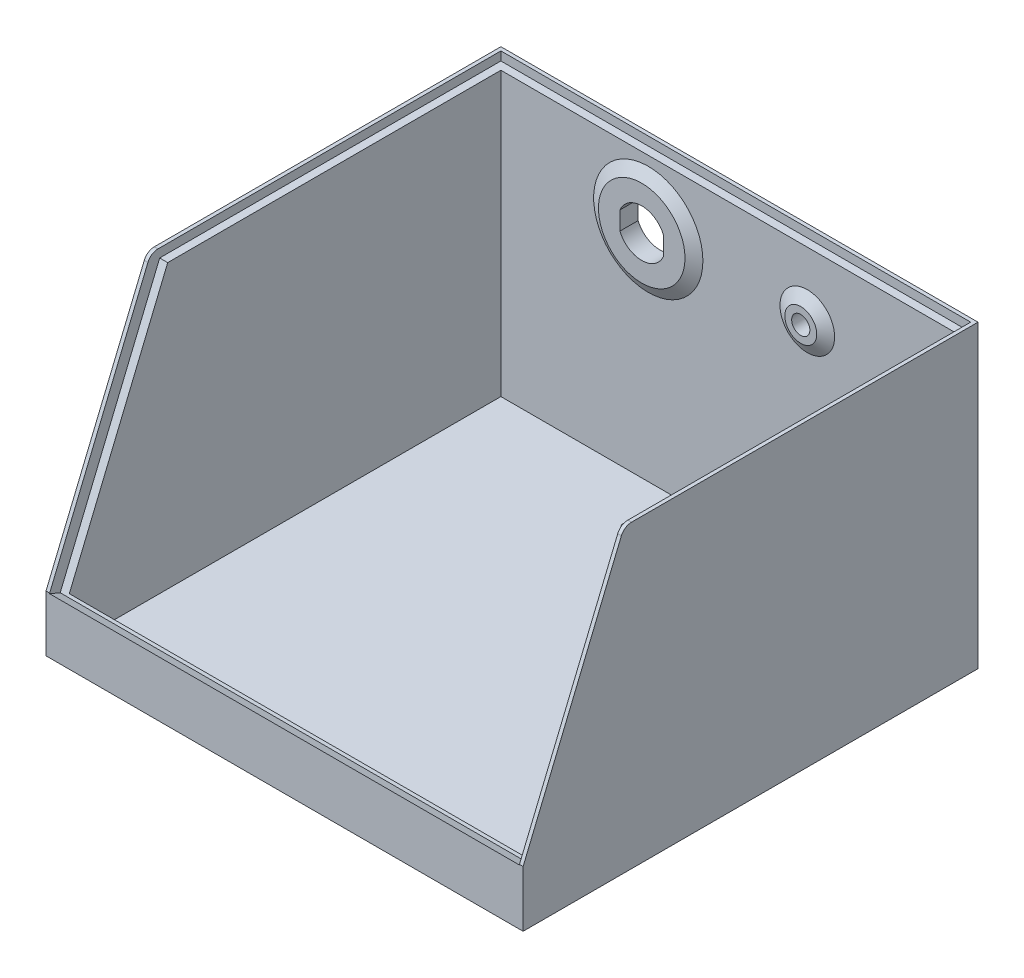
ISO-10303-21;
HEADER;
FILE_DESCRIPTION(('STEP AP214'),'2;1');
FILE_NAME('part.step','',(''),(''),'','','');
FILE_SCHEMA(('AUTOMOTIVE_DESIGN { 1 0 10303 214 1 1 1 1 }'));
ENDSEC;
DATA;
#1=APPLICATION_CONTEXT('core data for automotive mechanical design processes');
#2=APPLICATION_PROTOCOL_DEFINITION('international standard','automotive_design',2000,#1);
#3=PRODUCT_CONTEXT('',#1,'mechanical');
#4=PRODUCT('Part','Part','',(#3));
#5=PRODUCT_RELATED_PRODUCT_CATEGORY('part','',(#4));
#6=PRODUCT_DEFINITION_FORMATION('','',#4);
#7=PRODUCT_DEFINITION_CONTEXT('part definition',#1,'design');
#8=PRODUCT_DEFINITION('design','',#6,#7);
#9=PRODUCT_DEFINITION_SHAPE('','',#8);
#10=(LENGTH_UNIT() NAMED_UNIT(*) SI_UNIT(.MILLI.,.METRE.));
#11=(NAMED_UNIT(*) PLANE_ANGLE_UNIT() SI_UNIT($,.RADIAN.));
#12=(NAMED_UNIT(*) SI_UNIT($,.STERADIAN.) SOLID_ANGLE_UNIT());
#13=UNCERTAINTY_MEASURE_WITH_UNIT(LENGTH_MEASURE(1.E-05),#10,'distance_accuracy_value','');
#14=(GEOMETRIC_REPRESENTATION_CONTEXT(3) GLOBAL_UNCERTAINTY_ASSIGNED_CONTEXT((#13)) GLOBAL_UNIT_ASSIGNED_CONTEXT((#10,
#11,#12)) REPRESENTATION_CONTEXT('',''));
#15=CARTESIAN_POINT('',(0.,0.,0.));
#16=DIRECTION('',(0.,0.,1.));
#17=DIRECTION('',(1.,0.,0.));
#18=AXIS2_PLACEMENT_3D('',#15,#16,#17);
#19=CARTESIAN_POINT('',(0.,80.,-1.41509433962266));
#20=DIRECTION('',(0.,0.,-1.));
#21=DIRECTION('',(-1.,0.,0.));
#22=AXIS2_PLACEMENT_3D('',#19,#20,#21);
#23=PLANE('',#22);
#24=DIRECTION('',(0.,-1.,0.));
#25=VECTOR('',#24,1.);
#26=CARTESIAN_POINT('',(0.,80.,-1.41509433962266));
#27=LINE('',#26,#25);
#28=CARTESIAN_POINT('',(0.,12.3822143173166,-1.41509433962266));
#29=VERTEX_POINT('',#28);
#30=CARTESIAN_POINT('',(0.,0.,-1.41509433962266));
#31=VERTEX_POINT('',#30);
#32=EDGE_CURVE('E319',#29,#31,#27,.T.);
#33=ORIENTED_EDGE('',*,*,#32,.F.);
#34=DIRECTION('',(1.,0.,0.));
#35=VECTOR('',#34,1.);
#36=CARTESIAN_POINT('',(0.,12.3822143173166,-1.41509433962266));
#37=LINE('',#36,#35);
#38=CARTESIAN_POINT('',(124.6,12.3822143173166,-1.41509433962266));
#39=VERTEX_POINT('',#38);
#40=EDGE_CURVE('E286',#29,#39,#37,.T.);
#41=ORIENTED_EDGE('',*,*,#40,.T.);
#42=DIRECTION('',(0.,-1.,0.));
#43=VECTOR('',#42,1.);
#44=CARTESIAN_POINT('',(124.6,80.,-1.41509433962266));
#45=LINE('',#44,#43);
#46=CARTESIAN_POINT('',(124.6,0.,-1.41509433962266));
#47=VERTEX_POINT('',#46);
#48=EDGE_CURVE('E317',#39,#47,#45,.T.);
#49=ORIENTED_EDGE('',*,*,#48,.T.);
#50=DIRECTION('',(1.,0.,0.));
#51=VECTOR('',#50,1.);
#52=CARTESIAN_POINT('',(0.,0.,-1.41509433962266));
#53=LINE('',#52,#51);
#54=EDGE_CURVE('E304',#31,#47,#53,.T.);
#55=ORIENTED_EDGE('',*,*,#54,.F.);
#56=EDGE_LOOP('',(#33,#41,#49,#55));
#57=FACE_BOUND('',#56,.T.);
#58=ADVANCED_FACE('F39',(#57),#23,.T.);
#59=CARTESIAN_POINT('',(-3.20000000000001,13.0187338929315,1.78490566037734));
#60=DIRECTION('',(0.,-0.382683432365084,-0.923879532511289));
#61=DIRECTION('',(0.,0.923879532511289,-0.382683432365084));
#62=AXIS2_PLACEMENT_3D('',#59,#60,#61);
#63=PLANE('',#62);
#64=DIRECTION('',(0.,-0.923879532511289,0.382683432365084));
#65=VECTOR('',#64,1.);
#66=CARTESIAN_POINT('',(-2.20000000000001,80.,-25.9596431860913));
#67=LINE('',#66,#65);
#68=CARTESIAN_POINT('',(-2.20000000000001,78.1480502970952,-25.1925405023153));
#69=VERTEX_POINT('',#68);
#70=CARTESIAN_POINT('',(-2.2,13.0187338929315,1.78490566037735));
#71=VERTEX_POINT('',#70);
#72=EDGE_CURVE('E263',#69,#71,#67,.T.);
#73=ORIENTED_EDGE('',*,*,#72,.F.);
#74=DIRECTION('',(1.,0.,0.));
#75=VECTOR('',#74,1.);
#76=CARTESIAN_POINT('',(-3.20000000000001,78.1480502970953,-25.1925405023153));
#77=LINE('',#76,#75);
#78=CARTESIAN_POINT('',(-3.20000000000001,78.1480502970953,-25.1925405023153));
#79=VERTEX_POINT('',#78);
#80=EDGE_CURVE('E373',#69,#79,#77,.F.);
#81=ORIENTED_EDGE('',*,*,#80,.T.);
#82=DIRECTION('',(0.,0.923879532511289,-0.382683432365084));
#83=VECTOR('',#82,1.);
#84=CARTESIAN_POINT('',(-3.20000000000001,13.0187338929315,1.78490566037734));
#85=LINE('',#84,#83);
#86=CARTESIAN_POINT('',(-3.20000000000001,13.0187338929315,1.78490566037734));
#87=VERTEX_POINT('',#86);
#88=EDGE_CURVE('E292',#87,#79,#85,.T.);
#89=ORIENTED_EDGE('',*,*,#88,.F.);
#90=DIRECTION('',(1.,0.,0.));
#91=VECTOR('',#90,1.);
#92=CARTESIAN_POINT('',(-3.20000000000001,13.0187338929315,1.78490566037734));
#93=LINE('',#92,#91);
#94=EDGE_CURVE('E298',#87,#71,#93,.T.);
#95=ORIENTED_EDGE('',*,*,#94,.T.);
#96=EDGE_LOOP('',(#73,#81,#89,#95));
#97=FACE_BOUND('',#96,.T.);
#98=ADVANCED_FACE('F403',(#97),#63,.F.);
#99=CARTESIAN_POINT('',(-3.2,-2.4,0.));
#100=DIRECTION('',(1.,0.,0.));
#101=DIRECTION('',(0.,0.,-1.));
#102=AXIS2_PLACEMENT_3D('',#99,#100,#101);
#103=PLANE('',#102);
#104=ORIENTED_EDGE('',*,*,#88,.T.);
#105=CARTESIAN_POINT('',(-3.2,77.,-27.9641790998492));
#106=DIRECTION('',(1.,0.,0.));
#107=DIRECTION('',(0.,0.,-1.));
#108=AXIS2_PLACEMENT_3D('',#105,#106,#107);
#109=CIRCLE('',#108,3.);
#110=CARTESIAN_POINT('',(-3.2,80.,-27.9641790998492));
#111=VERTEX_POINT('',#110);
#112=EDGE_CURVE('E375',#79,#111,#109,.F.);
#113=ORIENTED_EDGE('',*,*,#112,.T.);
#114=DIRECTION('',(0.,0.,1.));
#115=VECTOR('',#114,1.);
#116=CARTESIAN_POINT('',(-3.2,80.,1.78490566037734));
#117=LINE('',#116,#115);
#118=CARTESIAN_POINT('',(-3.2,80.,-123.115094339623));
#119=VERTEX_POINT('',#118);
#120=EDGE_CURVE('E321',#119,#111,#117,.T.);
#121=ORIENTED_EDGE('',*,*,#120,.F.);
#122=DIRECTION('',(0.,1.,0.));
#123=VECTOR('',#122,1.);
#124=CARTESIAN_POINT('',(-3.2,-2.4,-123.115094339623));
#125=LINE('',#124,#123);
#126=CARTESIAN_POINT('',(-3.2,-2.4,-123.115094339623));
#127=VERTEX_POINT('',#126);
#128=EDGE_CURVE('E341',#127,#119,#125,.T.);
#129=ORIENTED_EDGE('',*,*,#128,.F.);
#130=DIRECTION('',(0.,0.,-1.));
#131=VECTOR('',#130,1.);
#132=CARTESIAN_POINT('',(-3.2,-2.4,0.));
#133=LINE('',#132,#131);
#134=CARTESIAN_POINT('',(-3.2,-2.4,1.78490566037734));
#135=VERTEX_POINT('',#134);
#136=EDGE_CURVE('E329',#135,#127,#133,.T.);
#137=ORIENTED_EDGE('',*,*,#136,.F.);
#138=DIRECTION('',(0.,1.,0.));
#139=VECTOR('',#138,1.);
#140=CARTESIAN_POINT('',(-3.2,-2.4,1.78490566037734));
#141=LINE('',#140,#139);
#142=EDGE_CURVE('E340',#135,#87,#141,.T.);
#143=ORIENTED_EDGE('',*,*,#142,.T.);
#144=EDGE_LOOP('',(#104,#113,#121,#129,#137,#143));
#145=FACE_BOUND('',#144,.T.);
#146=ADVANCED_FACE('F409',(#145),#103,.F.);
#147=CARTESIAN_POINT('',(0.,-2.4,-123.115094339623));
#148=DIRECTION('',(0.,0.,1.));
#149=DIRECTION('',(1.,0.,0.));
#150=AXIS2_PLACEMENT_3D('',#147,#148,#149);
#151=PLANE('',#150);
#152=DIRECTION('',(0.,-1.,0.));
#153=VECTOR('',#152,1.);
#154=CARTESIAN_POINT('',(34.4722666666666,0.,-123.115094339623));
#155=LINE('',#154,#153);
#156=CARTESIAN_POINT('',(34.4722666666667,62.5195980631839,-123.115094339623));
#157=VERTEX_POINT('',#156);
#158=CARTESIAN_POINT('',(34.4722666666667,57.4804019368161,-123.115094339623));
#159=VERTEX_POINT('',#158);
#160=EDGE_CURVE('E205',#157,#159,#155,.T.);
#161=ORIENTED_EDGE('',*,*,#160,.T.);
#162=CARTESIAN_POINT('',(40.4666666666667,60.,-123.115094339623));
#163=DIRECTION('',(0.,0.,-1.));
#164=DIRECTION('',(-1.,0.,0.));
#165=AXIS2_PLACEMENT_3D('',#162,#163,#164);
#166=CIRCLE('',#165,6.5024);
#167=CARTESIAN_POINT('',(46.4610666666667,57.4804019368161,-123.115094339623));
#168=VERTEX_POINT('',#167);
#169=EDGE_CURVE('E54',#168,#159,#166,.T.);
#170=ORIENTED_EDGE('',*,*,#169,.F.);
#171=DIRECTION('',(0.,-1.,0.));
#172=VECTOR('',#171,1.);
#173=CARTESIAN_POINT('',(46.4610666666667,0.,-123.115094339623));
#174=LINE('',#173,#172);
#175=CARTESIAN_POINT('',(46.4610666666667,62.5195980631839,-123.115094339623));
#176=VERTEX_POINT('',#175);
#177=EDGE_CURVE('E212',#176,#168,#174,.T.);
#178=ORIENTED_EDGE('',*,*,#177,.F.);
#179=CARTESIAN_POINT('',(40.4666666666667,60.,-123.115094339623));
#180=DIRECTION('',(0.,0.,-1.));
#181=DIRECTION('',(-1.,0.,0.));
#182=AXIS2_PLACEMENT_3D('',#179,#180,#181);
#183=CIRCLE('',#182,6.5024);
#184=EDGE_CURVE('E196',#157,#176,#183,.T.);
#185=ORIENTED_EDGE('',*,*,#184,.F.);
#186=EDGE_LOOP('',(#161,#170,#178,#185));
#187=FACE_BOUND('',#186,.T.);
#188=CARTESIAN_POINT('',(84.1333333333333,60.,-123.115094339623));
#189=DIRECTION('',(0.,0.,-1.));
#190=DIRECTION('',(-1.,0.,0.));
#191=AXIS2_PLACEMENT_3D('',#188,#189,#190);
#192=CIRCLE('',#191,2.5);
#193=CARTESIAN_POINT('',(81.6333333333333,60.,-123.115094339623));
#194=VERTEX_POINT('',#193);
#195=EDGE_CURVE('E222',#194,#194,#192,.T.);
#196=ORIENTED_EDGE('',*,*,#195,.F.);
#197=EDGE_LOOP('',(#196));
#198=FACE_BOUND('',#197,.T.);
#199=ORIENTED_EDGE('',*,*,#128,.T.);
#200=DIRECTION('',(-1.,0.,0.));
#201=VECTOR('',#200,1.);
#202=CARTESIAN_POINT('',(-3.2,80.,-123.115094339623));
#203=LINE('',#202,#201);
#204=CARTESIAN_POINT('',(127.8,80.,-123.115094339623));
#205=VERTEX_POINT('',#204);
#206=EDGE_CURVE('E326',#205,#119,#203,.T.);
#207=ORIENTED_EDGE('',*,*,#206,.F.);
#208=DIRECTION('',(0.,1.,0.));
#209=VECTOR('',#208,1.);
#210=CARTESIAN_POINT('',(127.8,-2.4,-123.115094339623));
#211=LINE('',#210,#209);
#212=CARTESIAN_POINT('',(127.8,-2.4,-123.115094339623));
#213=VERTEX_POINT('',#212);
#214=EDGE_CURVE('E344',#213,#205,#211,.T.);
#215=ORIENTED_EDGE('',*,*,#214,.F.);
#216=DIRECTION('',(1.,0.,0.));
#217=VECTOR('',#216,1.);
#218=CARTESIAN_POINT('',(0.,-2.4,-123.115094339623));
#219=LINE('',#218,#217);
#220=EDGE_CURVE('E338',#127,#213,#219,.T.);
#221=ORIENTED_EDGE('',*,*,#220,.F.);
#222=EDGE_LOOP('',(#199,#207,#215,#221));
#223=FACE_BOUND('',#222,.T.);
#224=ADVANCED_FACE('F209',(#187,#198,#223),#151,.F.);
#225=CARTESIAN_POINT('',(127.8,-2.4,0.));
#226=DIRECTION('',(1.,0.,0.));
#227=DIRECTION('',(0.,0.,-1.));
#228=AXIS2_PLACEMENT_3D('',#225,#226,#227);
#229=PLANE('',#228);
#230=DIRECTION('',(0.,0.,-1.));
#231=VECTOR('',#230,1.);
#232=CARTESIAN_POINT('',(127.8,80.,1.78490566037734));
#233=LINE('',#232,#231);
#234=CARTESIAN_POINT('',(127.8,80.,-27.9641790998492));
#235=VERTEX_POINT('',#234);
#236=EDGE_CURVE('E324',#235,#205,#233,.T.);
#237=ORIENTED_EDGE('',*,*,#236,.F.);
#238=CARTESIAN_POINT('',(127.8,77.,-27.9641790998492));
#239=DIRECTION('',(1.,0.,0.));
#240=DIRECTION('',(0.,0.,-1.));
#241=AXIS2_PLACEMENT_3D('',#238,#239,#240);
#242=CIRCLE('',#241,3.);
#243=CARTESIAN_POINT('',(127.8,78.1480502970953,-25.1925405023153));
#244=VERTEX_POINT('',#243);
#245=EDGE_CURVE('E365',#235,#244,#242,.T.);
#246=ORIENTED_EDGE('',*,*,#245,.T.);
#247=DIRECTION('',(0.,0.923879532511289,-0.382683432365084));
#248=VECTOR('',#247,1.);
#249=CARTESIAN_POINT('',(127.8,13.0187338929315,1.78490566037734));
#250=LINE('',#249,#248);
#251=CARTESIAN_POINT('',(127.8,13.0187338929315,1.78490566037734));
#252=VERTEX_POINT('',#251);
#253=EDGE_CURVE('E291',#252,#244,#250,.T.);
#254=ORIENTED_EDGE('',*,*,#253,.F.);
#255=DIRECTION('',(0.,1.,0.));
#256=VECTOR('',#255,1.);
#257=CARTESIAN_POINT('',(127.8,-2.4,1.78490566037734));
#258=LINE('',#257,#256);
#259=CARTESIAN_POINT('',(127.8,-2.4,1.78490566037734));
#260=VERTEX_POINT('',#259);
#261=EDGE_CURVE('E347',#260,#252,#258,.T.);
#262=ORIENTED_EDGE('',*,*,#261,.F.);
#263=DIRECTION('',(0.,0.,-1.));
#264=VECTOR('',#263,1.);
#265=CARTESIAN_POINT('',(127.8,-2.4,0.));
#266=LINE('',#265,#264);
#267=EDGE_CURVE('E335',#260,#213,#266,.T.);
#268=ORIENTED_EDGE('',*,*,#267,.T.);
#269=ORIENTED_EDGE('',*,*,#214,.T.);
#270=EDGE_LOOP('',(#237,#246,#254,#262,#268,#269));
#271=FACE_BOUND('',#270,.T.);
#272=ADVANCED_FACE('F438',(#271),#229,.T.);
#273=CARTESIAN_POINT('',(0.,-2.4,1.78490566037734));
#274=DIRECTION('',(0.,0.,1.));
#275=DIRECTION('',(1.,0.,0.));
#276=AXIS2_PLACEMENT_3D('',#273,#274,#275);
#277=PLANE('',#276);
#278=DIRECTION('',(0.,-1.,0.));
#279=VECTOR('',#278,1.);
#280=CARTESIAN_POINT('',(-2.2,-2.4,1.78490566037734));
#281=LINE('',#280,#279);
#282=CARTESIAN_POINT('',(-2.2,12.8563750628877,1.78490566037734));
#283=VERTEX_POINT('',#282);
#284=EDGE_CURVE('E284',#71,#283,#281,.T.);
#285=ORIENTED_EDGE('',*,*,#284,.F.);
#286=ORIENTED_EDGE('',*,*,#94,.F.);
#287=ORIENTED_EDGE('',*,*,#142,.F.);
#288=DIRECTION('',(1.,0.,0.));
#289=VECTOR('',#288,1.);
#290=CARTESIAN_POINT('',(0.,-2.4,1.78490566037734));
#291=LINE('',#290,#289);
#292=EDGE_CURVE('E332',#135,#260,#291,.T.);
#293=ORIENTED_EDGE('',*,*,#292,.T.);
#294=ORIENTED_EDGE('',*,*,#261,.T.);
#295=CARTESIAN_POINT('',(126.8,13.0187338929315,1.78490566037734));
#296=VERTEX_POINT('',#295);
#297=EDGE_CURVE('E295',#296,#252,#93,.T.);
#298=ORIENTED_EDGE('',*,*,#297,.F.);
#299=DIRECTION('',(0.,1.,0.));
#300=VECTOR('',#299,1.);
#301=CARTESIAN_POINT('',(126.8,-2.4,1.78490566037734));
#302=LINE('',#301,#300);
#303=CARTESIAN_POINT('',(126.8,12.8563750628877,1.78490566037734));
#304=VERTEX_POINT('',#303);
#305=EDGE_CURVE('E280',#304,#296,#302,.T.);
#306=ORIENTED_EDGE('',*,*,#305,.F.);
#307=DIRECTION('',(1.,0.,0.));
#308=VECTOR('',#307,1.);
#309=CARTESIAN_POINT('',(0.,12.8563750628877,1.78490566037734));
#310=LINE('',#309,#308);
#311=EDGE_CURVE('E354',#283,#304,#310,.T.);
#312=ORIENTED_EDGE('',*,*,#311,.F.);
#313=EDGE_LOOP('',(#285,#286,#287,#293,#294,#298,#306,#312));
#314=FACE_BOUND('',#313,.T.);
#315=ADVANCED_FACE('F429',(#314),#277,.T.);
#316=CARTESIAN_POINT('',(0.,-2.4,0.));
#317=DIRECTION('',(0.,1.,0.));
#318=DIRECTION('',(0.,0.,1.));
#319=AXIS2_PLACEMENT_3D('',#316,#317,#318);
#320=PLANE('',#319);
#321=ORIENTED_EDGE('',*,*,#136,.T.);
#322=ORIENTED_EDGE('',*,*,#220,.T.);
#323=ORIENTED_EDGE('',*,*,#267,.F.);
#324=ORIENTED_EDGE('',*,*,#292,.F.);
#325=EDGE_LOOP('',(#321,#322,#323,#324));
#326=FACE_BOUND('',#325,.T.);
#327=ADVANCED_FACE('F425',(#326),#320,.F.);
#328=CARTESIAN_POINT('',(0.,80.,0.));
#329=DIRECTION('',(0.,-1.,0.));
#330=DIRECTION('',(0.,0.,-1.));
#331=AXIS2_PLACEMENT_3D('',#328,#329,#330);
#332=PLANE('',#331);
#333=DIRECTION('',(0.,0.,-1.));
#334=VECTOR('',#333,1.);
#335=CARTESIAN_POINT('',(126.8,80.,-25.9596431860913));
#336=LINE('',#335,#334);
#337=CARTESIAN_POINT('',(126.8,80.,-27.9641790998492));
#338=VERTEX_POINT('',#337);
#339=CARTESIAN_POINT('',(126.8,80.,-122.115094339623));
#340=VERTEX_POINT('',#339);
#341=EDGE_CURVE('E249',#338,#340,#336,.T.);
#342=ORIENTED_EDGE('',*,*,#341,.F.);
#343=DIRECTION('',(1.,0.,0.));
#344=VECTOR('',#343,1.);
#345=CARTESIAN_POINT('',(0.,80.,-27.9641790998492));
#346=LINE('',#345,#344);
#347=EDGE_CURVE('E362',#338,#235,#346,.T.);
#348=ORIENTED_EDGE('',*,*,#347,.T.);
#349=ORIENTED_EDGE('',*,*,#236,.T.);
#350=ORIENTED_EDGE('',*,*,#206,.T.);
#351=ORIENTED_EDGE('',*,*,#120,.T.);
#352=DIRECTION('',(1.,0.,0.));
#353=VECTOR('',#352,1.);
#354=CARTESIAN_POINT('',(0.,80.,-27.9641790998492));
#355=LINE('',#354,#353);
#356=CARTESIAN_POINT('',(-2.20000000000001,80.,-27.9641790998492));
#357=VERTEX_POINT('',#356);
#358=EDGE_CURVE('E359',#111,#357,#355,.T.);
#359=ORIENTED_EDGE('',*,*,#358,.T.);
#360=DIRECTION('',(0.,0.,1.));
#361=VECTOR('',#360,1.);
#362=CARTESIAN_POINT('',(-2.20000000000001,80.,-25.9596431860913));
#363=LINE('',#362,#361);
#364=CARTESIAN_POINT('',(-2.20000000000001,80.,-122.115094339623));
#365=VERTEX_POINT('',#364);
#366=EDGE_CURVE('E237',#365,#357,#363,.T.);
#367=ORIENTED_EDGE('',*,*,#366,.F.);
#368=DIRECTION('',(-1.,0.,0.));
#369=VECTOR('',#368,1.);
#370=CARTESIAN_POINT('',(-2.20000000000001,80.,-122.115094339623));
#371=LINE('',#370,#369);
#372=EDGE_CURVE('E241',#340,#365,#371,.T.);
#373=ORIENTED_EDGE('',*,*,#372,.F.);
#374=EDGE_LOOP('',(#342,#348,#349,#350,#351,#359,#367,#373));
#375=FACE_BOUND('',#374,.T.);
#376=ADVANCED_FACE('F421',(#375),#332,.F.);
#377=CARTESIAN_POINT('',(0.,80.,-1.41509433962266));
#378=DIRECTION('',(1.,0.,0.));
#379=DIRECTION('',(0.,0.,-1.));
#380=AXIS2_PLACEMENT_3D('',#377,#378,#379);
#381=PLANE('',#380);
#382=DIRECTION('',(0.,0.,-1.));
#383=VECTOR('',#382,1.);
#384=CARTESIAN_POINT('',(0.,77.6,-1.41509433962266));
#385=LINE('',#384,#383);
#386=CARTESIAN_POINT('',(0.,77.6,-28.4291856773315));
#387=VERTEX_POINT('',#386);
#388=CARTESIAN_POINT('',(0.,77.6,-119.915094339623));
#389=VERTEX_POINT('',#388);
#390=EDGE_CURVE('E261',#387,#389,#385,.T.);
#391=ORIENTED_EDGE('',*,*,#390,.F.);
#392=DIRECTION('',(0.,-0.923879532511289,0.382683432365084));
#393=VECTOR('',#392,1.);
#394=CARTESIAN_POINT('',(0.,70.0976045511806,-25.3215917321444));
#395=LINE('',#394,#393);
#396=EDGE_CURVE('E289',#387,#29,#395,.T.);
#397=ORIENTED_EDGE('',*,*,#396,.T.);
#398=ORIENTED_EDGE('',*,*,#32,.T.);
#399=DIRECTION('',(0.,0.,1.));
#400=VECTOR('',#399,1.);
#401=CARTESIAN_POINT('',(0.,0.,-1.41509433962266));
#402=LINE('',#401,#400);
#403=CARTESIAN_POINT('',(0.,0.,-119.915094339623));
#404=VERTEX_POINT('',#403);
#405=EDGE_CURVE('E301',#404,#31,#402,.T.);
#406=ORIENTED_EDGE('',*,*,#405,.F.);
#407=DIRECTION('',(0.,-1.,0.));
#408=VECTOR('',#407,1.);
#409=CARTESIAN_POINT('',(0.,80.,-119.915094339623));
#410=LINE('',#409,#408);
#411=EDGE_CURVE('E313',#389,#404,#410,.T.);
#412=ORIENTED_EDGE('',*,*,#411,.F.);
#413=EDGE_LOOP('',(#391,#397,#398,#406,#412));
#414=FACE_BOUND('',#413,.T.);
#415=ADVANCED_FACE('F418',(#414),#381,.T.);
#416=CARTESIAN_POINT('',(124.6,80.,-1.41509433962266));
#417=DIRECTION('',(-1.,0.,0.));
#418=DIRECTION('',(0.,0.,1.));
#419=AXIS2_PLACEMENT_3D('',#416,#417,#418);
#420=PLANE('',#419);
#421=DIRECTION('',(0.,0.,1.));
#422=VECTOR('',#421,1.);
#423=CARTESIAN_POINT('',(124.6,77.6,-1.41509433962266));
#424=LINE('',#423,#422);
#425=CARTESIAN_POINT('',(124.6,77.6,-119.915094339623));
#426=VERTEX_POINT('',#425);
#427=CARTESIAN_POINT('',(124.6,77.6,-28.4291856773315));
#428=VERTEX_POINT('',#427);
#429=EDGE_CURVE('E255',#426,#428,#424,.T.);
#430=ORIENTED_EDGE('',*,*,#429,.F.);
#431=DIRECTION('',(0.,-1.,0.));
#432=VECTOR('',#431,1.);
#433=CARTESIAN_POINT('',(124.6,80.,-119.915094339623));
#434=LINE('',#433,#432);
#435=CARTESIAN_POINT('',(124.6,0.,-119.915094339623));
#436=VERTEX_POINT('',#435);
#437=EDGE_CURVE('E315',#426,#436,#434,.T.);
#438=ORIENTED_EDGE('',*,*,#437,.T.);
#439=DIRECTION('',(0.,0.,-1.));
#440=VECTOR('',#439,1.);
#441=CARTESIAN_POINT('',(124.6,0.,-1.41509433962266));
#442=LINE('',#441,#440);
#443=EDGE_CURVE('E307',#47,#436,#442,.T.);
#444=ORIENTED_EDGE('',*,*,#443,.F.);
#445=ORIENTED_EDGE('',*,*,#48,.F.);
#446=DIRECTION('',(0.,0.923879532511289,-0.382683432365084));
#447=VECTOR('',#446,1.);
#448=CARTESIAN_POINT('',(124.6,70.0976045511806,-25.3215917321444));
#449=LINE('',#448,#447);
#450=EDGE_CURVE('E343',#39,#428,#449,.T.);
#451=ORIENTED_EDGE('',*,*,#450,.T.);
#452=EDGE_LOOP('',(#430,#438,#444,#445,#451));
#453=FACE_BOUND('',#452,.T.);
#454=ADVANCED_FACE('F416',(#453),#420,.T.);
#455=CARTESIAN_POINT('',(0.,80.,-119.915094339623));
#456=DIRECTION('',(0.,0.,1.));
#457=DIRECTION('',(1.,0.,0.));
#458=AXIS2_PLACEMENT_3D('',#455,#456,#457);
#459=PLANE('',#458);
#460=CARTESIAN_POINT('',(84.1333333333333,60.,-119.915094339623));
#461=DIRECTION('',(0.,0.,1.));
#462=DIRECTION('',(1.,0.,0.));
#463=AXIS2_PLACEMENT_3D('',#460,#461,#462);
#464=CIRCLE('',#463,7.50000000000001);
#465=CARTESIAN_POINT('',(91.6333333333333,60.,-119.915094339623));
#466=VERTEX_POINT('',#465);
#467=EDGE_CURVE('E225',#466,#466,#464,.T.);
#468=ORIENTED_EDGE('',*,*,#467,.F.);
#469=EDGE_LOOP('',(#468));
#470=FACE_BOUND('',#469,.T.);
#471=CARTESIAN_POINT('',(40.4666666666667,60.,-119.915094339623));
#472=DIRECTION('',(0.,0.,1.));
#473=DIRECTION('',(1.,0.,0.));
#474=AXIS2_PLACEMENT_3D('',#471,#472,#473);
#475=CIRCLE('',#474,15.);
#476=CARTESIAN_POINT('',(55.4666666666667,60.,-119.915094339623));
#477=VERTEX_POINT('',#476);
#478=EDGE_CURVE('E231',#477,#477,#475,.T.);
#479=ORIENTED_EDGE('',*,*,#478,.F.);
#480=EDGE_LOOP('',(#479));
#481=FACE_BOUND('',#480,.T.);
#482=DIRECTION('',(1.,0.,0.));
#483=VECTOR('',#482,1.);
#484=CARTESIAN_POINT('',(0.,77.6,-119.915094339623));
#485=LINE('',#484,#483);
#486=EDGE_CURVE('E259',#389,#426,#485,.T.);
#487=ORIENTED_EDGE('',*,*,#486,.F.);
#488=ORIENTED_EDGE('',*,*,#411,.T.);
#489=DIRECTION('',(-1.,0.,0.));
#490=VECTOR('',#489,1.);
#491=CARTESIAN_POINT('',(0.,0.,-119.915094339623));
#492=LINE('',#491,#490);
#493=EDGE_CURVE('E310',#436,#404,#492,.T.);
#494=ORIENTED_EDGE('',*,*,#493,.F.);
#495=ORIENTED_EDGE('',*,*,#437,.F.);
#496=EDGE_LOOP('',(#487,#488,#494,#495));
#497=FACE_BOUND('',#496,.T.);
#498=ADVANCED_FACE('F434',(#470,#481,#497),#459,.T.);
#499=CARTESIAN_POINT('',(0.,0.,0.));
#500=DIRECTION('',(0.,1.,0.));
#501=DIRECTION('',(0.,0.,1.));
#502=AXIS2_PLACEMENT_3D('',#499,#500,#501);
#503=PLANE('',#502);
#504=ORIENTED_EDGE('',*,*,#405,.T.);
#505=ORIENTED_EDGE('',*,*,#54,.T.);
#506=ORIENTED_EDGE('',*,*,#443,.T.);
#507=ORIENTED_EDGE('',*,*,#493,.T.);
#508=EDGE_LOOP('',(#504,#505,#506,#507));
#509=FACE_BOUND('',#508,.T.);
#510=ADVANCED_FACE('F431',(#509),#503,.T.);
#511=ORIENTED_EDGE('',*,*,#253,.T.);
#512=DIRECTION('',(1.,0.,0.));
#513=VECTOR('',#512,1.);
#514=CARTESIAN_POINT('',(-3.20000000000001,78.1480502970953,-25.1925405023153));
#515=LINE('',#514,#513);
#516=CARTESIAN_POINT('',(126.8,78.1480502970952,-25.1925405023153));
#517=VERTEX_POINT('',#516);
#518=EDGE_CURVE('E367',#244,#517,#515,.F.);
#519=ORIENTED_EDGE('',*,*,#518,.T.);
#520=DIRECTION('',(0.,0.923879532511289,-0.382683432365084));
#521=VECTOR('',#520,1.);
#522=CARTESIAN_POINT('',(126.8,80.,-25.9596431860913));
#523=LINE('',#522,#521);
#524=EDGE_CURVE('E267',#296,#517,#523,.T.);
#525=ORIENTED_EDGE('',*,*,#524,.F.);
#526=ORIENTED_EDGE('',*,*,#297,.T.);
#527=EDGE_LOOP('',(#511,#519,#525,#526));
#528=FACE_BOUND('',#527,.T.);
#529=ADVANCED_FACE('F412',(#528),#63,.F.);
#530=CARTESIAN_POINT('',(-2.20000000000001,78.7754130164317,-28.9160576901274));
#531=DIRECTION('',(-1.,0.,0.));
#532=DIRECTION('',(0.,-1.,0.));
#533=AXIS2_PLACEMENT_3D('',#530,#531,#532);
#534=PLANE('',#533);
#535=ORIENTED_EDGE('',*,*,#366,.T.);
#536=CARTESIAN_POINT('',(-2.20000000000001,77.,-27.9641790998492));
#537=DIRECTION('',(-1.,0.,0.));
#538=DIRECTION('',(0.,-1.,0.));
#539=AXIS2_PLACEMENT_3D('',#536,#537,#538);
#540=CIRCLE('',#539,3.);
#541=EDGE_CURVE('E371',#357,#69,#540,.F.);
#542=ORIENTED_EDGE('',*,*,#541,.T.);
#543=ORIENTED_EDGE('',*,*,#72,.T.);
#544=ORIENTED_EDGE('',*,*,#284,.T.);
#545=DIRECTION('',(0.,0.382683432365084,0.923879532511289));
#546=VECTOR('',#545,1.);
#547=CARTESIAN_POINT('',(-2.2,11.6555649794866,-1.11410632880403));
#548=LINE('',#547,#546);
#549=CARTESIAN_POINT('',(-2.2,11.6555649794866,-1.11410632880403));
#550=VERTEX_POINT('',#549);
#551=EDGE_CURVE('E273',#550,#283,#548,.T.);
#552=ORIENTED_EDGE('',*,*,#551,.F.);
#553=DIRECTION('',(0.,-0.923879532511289,0.382683432365084));
#554=VECTOR('',#553,1.);
#555=CARTESIAN_POINT('',(-2.20000000000001,78.7754130164317,-28.9160576901274));
#556=LINE('',#555,#554);
#557=CARTESIAN_POINT('',(-2.20000000000001,77.6,-28.4291856773315));
#558=VERTEX_POINT('',#557);
#559=EDGE_CURVE('E264',#558,#550,#556,.T.);
#560=ORIENTED_EDGE('',*,*,#559,.F.);
#561=DIRECTION('',(0.,0.,1.));
#562=VECTOR('',#561,1.);
#563=CARTESIAN_POINT('',(-2.20000000000001,77.6,-25.9596431860913));
#564=LINE('',#563,#562);
#565=CARTESIAN_POINT('',(-2.20000000000001,77.6,-122.115094339623));
#566=VERTEX_POINT('',#565);
#567=EDGE_CURVE('E238',#566,#558,#564,.T.);
#568=ORIENTED_EDGE('',*,*,#567,.F.);
#569=DIRECTION('',(0.,1.,0.));
#570=VECTOR('',#569,1.);
#571=CARTESIAN_POINT('',(-2.20000000000001,77.6,-122.115094339623));
#572=LINE('',#571,#570);
#573=EDGE_CURVE('E253',#566,#365,#572,.T.);
#574=ORIENTED_EDGE('',*,*,#573,.T.);
#575=EDGE_LOOP('',(#535,#542,#543,#544,#552,#560,#568,#574));
#576=FACE_BOUND('',#575,.T.);
#577=ADVANCED_FACE('F502',(#576),#534,.F.);
#578=CARTESIAN_POINT('',(126.8,78.7754130164317,-28.9160576901274));
#579=DIRECTION('',(1.,0.,0.));
#580=DIRECTION('',(0.,0.,-1.));
#581=AXIS2_PLACEMENT_3D('',#578,#579,#580);
#582=PLANE('',#581);
#583=ORIENTED_EDGE('',*,*,#524,.T.);
#584=CARTESIAN_POINT('',(126.8,77.,-27.9641790998492));
#585=DIRECTION('',(1.,0.,0.));
#586=DIRECTION('',(0.,0.,-1.));
#587=AXIS2_PLACEMENT_3D('',#584,#585,#586);
#588=CIRCLE('',#587,3.);
#589=EDGE_CURVE('E369',#517,#338,#588,.F.);
#590=ORIENTED_EDGE('',*,*,#589,.T.);
#591=ORIENTED_EDGE('',*,*,#341,.T.);
#592=DIRECTION('',(0.,1.,0.));
#593=VECTOR('',#592,1.);
#594=CARTESIAN_POINT('',(126.8,77.6,-122.115094339623));
#595=LINE('',#594,#593);
#596=CARTESIAN_POINT('',(126.8,77.6,-122.115094339623));
#597=VERTEX_POINT('',#596);
#598=EDGE_CURVE('E246',#597,#340,#595,.T.);
#599=ORIENTED_EDGE('',*,*,#598,.F.);
#600=DIRECTION('',(0.,0.,-1.));
#601=VECTOR('',#600,1.);
#602=CARTESIAN_POINT('',(126.8,77.6,-25.9596431860913));
#603=LINE('',#602,#601);
#604=CARTESIAN_POINT('',(126.8,77.6,-28.4291856773315));
#605=VERTEX_POINT('',#604);
#606=EDGE_CURVE('E240',#605,#597,#603,.T.);
#607=ORIENTED_EDGE('',*,*,#606,.F.);
#608=DIRECTION('',(0.,0.923879532511289,-0.382683432365084));
#609=VECTOR('',#608,1.);
#610=CARTESIAN_POINT('',(126.8,78.7754130164317,-28.9160576901274));
#611=LINE('',#610,#609);
#612=CARTESIAN_POINT('',(126.8,11.6555649794866,-1.11410632880403));
#613=VERTEX_POINT('',#612);
#614=EDGE_CURVE('E270',#613,#605,#611,.T.);
#615=ORIENTED_EDGE('',*,*,#614,.F.);
#616=DIRECTION('',(0.,0.382683432365084,0.923879532511289));
#617=VECTOR('',#616,1.);
#618=CARTESIAN_POINT('',(126.8,11.6555649794866,-1.11410632880403));
#619=LINE('',#618,#617);
#620=EDGE_CURVE('E277',#613,#304,#619,.T.);
#621=ORIENTED_EDGE('',*,*,#620,.T.);
#622=ORIENTED_EDGE('',*,*,#305,.T.);
#623=EDGE_LOOP('',(#583,#590,#591,#599,#607,#615,#621,#622));
#624=FACE_BOUND('',#623,.T.);
#625=ADVANCED_FACE('F465',(#624),#582,.F.);
#626=CARTESIAN_POINT('',(-2.2,11.6555649794866,-1.11410632880403));
#627=DIRECTION('',(0.,-0.923879532511289,0.382683432365084));
#628=DIRECTION('',(0.,-0.382683432365084,-0.923879532511289));
#629=AXIS2_PLACEMENT_3D('',#626,#627,#628);
#630=PLANE('',#629);
#631=ORIENTED_EDGE('',*,*,#311,.T.);
#632=ORIENTED_EDGE('',*,*,#620,.F.);
#633=DIRECTION('',(1.,0.,0.));
#634=VECTOR('',#633,1.);
#635=CARTESIAN_POINT('',(-2.2,11.6555649794866,-1.11410632880403));
#636=LINE('',#635,#634);
#637=EDGE_CURVE('E266',#550,#613,#636,.T.);
#638=ORIENTED_EDGE('',*,*,#637,.F.);
#639=ORIENTED_EDGE('',*,*,#551,.T.);
#640=EDGE_LOOP('',(#631,#632,#638,#639));
#641=FACE_BOUND('',#640,.T.);
#642=ADVANCED_FACE('F484',(#641),#630,.F.);
#643=CARTESIAN_POINT('',(0.,1.31302190193545,3.16991528334554));
#644=DIRECTION('',(0.,0.382683432365084,0.923879532511289));
#645=DIRECTION('',(0.,-0.923879532511289,0.382683432365084));
#646=AXIS2_PLACEMENT_3D('',#643,#644,#645);
#647=PLANE('',#646);
#648=DIRECTION('',(1.,0.,0.));
#649=VECTOR('',#648,1.);
#650=CARTESIAN_POINT('',(0.,77.6,-28.4291856773315));
#651=LINE('',#650,#649);
#652=EDGE_CURVE('E358',#558,#387,#651,.T.);
#653=ORIENTED_EDGE('',*,*,#652,.F.);
#654=ORIENTED_EDGE('',*,*,#559,.T.);
#655=ORIENTED_EDGE('',*,*,#637,.T.);
#656=ORIENTED_EDGE('',*,*,#614,.T.);
#657=EDGE_CURVE('E356',#428,#605,#651,.T.);
#658=ORIENTED_EDGE('',*,*,#657,.F.);
#659=ORIENTED_EDGE('',*,*,#450,.F.);
#660=ORIENTED_EDGE('',*,*,#40,.F.);
#661=ORIENTED_EDGE('',*,*,#396,.F.);
#662=EDGE_LOOP('',(#653,#654,#655,#656,#658,#659,#660,#661));
#663=FACE_BOUND('',#662,.T.);
#664=ADVANCED_FACE('F479',(#663),#647,.T.);
#665=CARTESIAN_POINT('',(-2.20000000000001,77.6,-122.115094339623));
#666=DIRECTION('',(0.,0.,-1.));
#667=DIRECTION('',(-1.,0.,0.));
#668=AXIS2_PLACEMENT_3D('',#665,#666,#667);
#669=PLANE('',#668);
#670=ORIENTED_EDGE('',*,*,#372,.T.);
#671=ORIENTED_EDGE('',*,*,#573,.F.);
#672=DIRECTION('',(-1.,0.,0.));
#673=VECTOR('',#672,1.);
#674=CARTESIAN_POINT('',(-2.20000000000001,77.6,-122.115094339623));
#675=LINE('',#674,#673);
#676=EDGE_CURVE('E243',#597,#566,#675,.T.);
#677=ORIENTED_EDGE('',*,*,#676,.F.);
#678=ORIENTED_EDGE('',*,*,#598,.T.);
#679=EDGE_LOOP('',(#670,#671,#677,#678));
#680=FACE_BOUND('',#679,.T.);
#681=ADVANCED_FACE('F457',(#680),#669,.F.);
#682=CARTESIAN_POINT('',(0.,77.6,0.));
#683=DIRECTION('',(0.,-1.,0.));
#684=DIRECTION('',(0.,0.,-1.));
#685=AXIS2_PLACEMENT_3D('',#682,#683,#684);
#686=PLANE('',#685);
#687=ORIENTED_EDGE('',*,*,#652,.T.);
#688=ORIENTED_EDGE('',*,*,#390,.T.);
#689=ORIENTED_EDGE('',*,*,#486,.T.);
#690=ORIENTED_EDGE('',*,*,#429,.T.);
#691=ORIENTED_EDGE('',*,*,#657,.T.);
#692=ORIENTED_EDGE('',*,*,#606,.T.);
#693=ORIENTED_EDGE('',*,*,#676,.T.);
#694=ORIENTED_EDGE('',*,*,#567,.T.);
#695=EDGE_LOOP('',(#687,#688,#689,#690,#691,#692,#693,#694));
#696=FACE_BOUND('',#695,.T.);
#697=ADVANCED_FACE('F449',(#696),#686,.F.);
#698=CARTESIAN_POINT('',(0.,77.,-27.9641790998492));
#699=DIRECTION('',(1.,0.,0.));
#700=DIRECTION('',(0.,0.,-1.));
#701=AXIS2_PLACEMENT_3D('',#698,#699,#700);
#702=CYLINDRICAL_SURFACE('',#701,3.);
#703=ORIENTED_EDGE('',*,*,#589,.F.);
#704=ORIENTED_EDGE('',*,*,#518,.F.);
#705=ORIENTED_EDGE('',*,*,#245,.F.);
#706=ORIENTED_EDGE('',*,*,#347,.F.);
#707=EDGE_LOOP('',(#703,#704,#705,#706));
#708=FACE_BOUND('',#707,.T.);
#709=ADVANCED_FACE('F447',(#708),#702,.T.);
#710=CARTESIAN_POINT('',(0.,77.,-27.9641790998492));
#711=DIRECTION('',(1.,0.,0.));
#712=DIRECTION('',(0.,0.,-1.));
#713=AXIS2_PLACEMENT_3D('',#710,#711,#712);
#714=CYLINDRICAL_SURFACE('',#713,3.);
#715=ORIENTED_EDGE('',*,*,#112,.F.);
#716=ORIENTED_EDGE('',*,*,#80,.F.);
#717=ORIENTED_EDGE('',*,*,#541,.F.);
#718=ORIENTED_EDGE('',*,*,#358,.F.);
#719=EDGE_LOOP('',(#715,#716,#717,#718));
#720=FACE_BOUND('',#719,.T.);
#721=ADVANCED_FACE('F41',(#720),#714,.T.);
#722=CARTESIAN_POINT('',(40.4666666666667,60.,-119.915094339623));
#723=DIRECTION('',(0.,0.,-1.));
#724=DIRECTION('',(1.,0.,0.));
#725=AXIS2_PLACEMENT_3D('',#722,#723,#724);
#726=CONICAL_SURFACE('',#725,15.,1.0471975511966);
#727=ORIENTED_EDGE('',*,*,#478,.T.);
#728=EDGE_LOOP('',(#727));
#729=FACE_BOUND('',#728,.T.);
#730=CARTESIAN_POINT('',(40.4666666666667,60.,-118.115094339623));
#731=DIRECTION('',(0.,0.,1.));
#732=DIRECTION('',(1.,0.,0.));
#733=AXIS2_PLACEMENT_3D('',#730,#731,#732);
#734=CIRCLE('',#733,11.882308546376);
#735=CARTESIAN_POINT('',(52.3489752130426,60.,-118.115094339623));
#736=VERTEX_POINT('',#735);
#737=EDGE_CURVE('E234',#736,#736,#734,.T.);
#738=ORIENTED_EDGE('',*,*,#737,.F.);
#739=EDGE_LOOP('',(#738));
#740=FACE_BOUND('',#739,.T.);
#741=ADVANCED_FACE('F455',(#729,#740),#726,.T.);
#742=CARTESIAN_POINT('',(0.,-2.4,-118.115094339623));
#743=DIRECTION('',(0.,0.,1.));
#744=DIRECTION('',(1.,0.,0.));
#745=AXIS2_PLACEMENT_3D('',#742,#743,#744);
#746=PLANE('',#745);
#747=CARTESIAN_POINT('',(40.4666666666667,60.,-118.115094339623));
#748=DIRECTION('',(0.,0.,1.));
#749=DIRECTION('',(1.,0.,0.));
#750=AXIS2_PLACEMENT_3D('',#747,#748,#749);
#751=CIRCLE('',#750,6.5024);
#752=CARTESIAN_POINT('',(34.4722666666667,57.4804019368161,-118.115094339623));
#753=VERTEX_POINT('',#752);
#754=CARTESIAN_POINT('',(46.4610666666667,57.4804019368161,-118.115094339623));
#755=VERTEX_POINT('',#754);
#756=EDGE_CURVE('E12',#753,#755,#751,.T.);
#757=ORIENTED_EDGE('',*,*,#756,.F.);
#758=DIRECTION('',(0.,1.,0.));
#759=VECTOR('',#758,1.);
#760=CARTESIAN_POINT('',(34.4722666666666,-2.40000000000005,-118.115094339623));
#761=LINE('',#760,#759);
#762=CARTESIAN_POINT('',(34.4722666666667,62.5195980631839,-118.115094339623));
#763=VERTEX_POINT('',#762);
#764=EDGE_CURVE('E377',#753,#763,#761,.T.);
#765=ORIENTED_EDGE('',*,*,#764,.T.);
#766=CARTESIAN_POINT('',(40.4666666666667,60.,-118.115094339623));
#767=DIRECTION('',(0.,0.,1.));
#768=DIRECTION('',(1.,0.,0.));
#769=AXIS2_PLACEMENT_3D('',#766,#767,#768);
#770=CIRCLE('',#769,6.5024);
#771=CARTESIAN_POINT('',(46.4610666666667,62.5195980631839,-118.115094339623));
#772=VERTEX_POINT('',#771);
#773=EDGE_CURVE('E199',#772,#763,#770,.T.);
#774=ORIENTED_EDGE('',*,*,#773,.F.);
#775=DIRECTION('',(0.,1.,0.));
#776=VECTOR('',#775,1.);
#777=CARTESIAN_POINT('',(46.4610666666667,-2.4,-118.115094339623));
#778=LINE('',#777,#776);
#779=EDGE_CURVE('E47',#755,#772,#778,.T.);
#780=ORIENTED_EDGE('',*,*,#779,.F.);
#781=EDGE_LOOP('',(#757,#765,#774,#780));
#782=FACE_BOUND('',#781,.T.);
#783=ORIENTED_EDGE('',*,*,#737,.T.);
#784=EDGE_LOOP('',(#783));
#785=FACE_BOUND('',#784,.T.);
#786=ADVANCED_FACE('F387',(#782,#785),#746,.T.);
#787=CARTESIAN_POINT('',(84.1333333333333,60.,-119.915094339623));
#788=DIRECTION('',(0.,0.,-1.));
#789=DIRECTION('',(1.,0.,0.));
#790=AXIS2_PLACEMENT_3D('',#787,#788,#789);
#791=CONICAL_SURFACE('',#790,7.50000000000001,1.0471975511966);
#792=ORIENTED_EDGE('',*,*,#467,.T.);
#793=EDGE_LOOP('',(#792));
#794=FACE_BOUND('',#793,.T.);
#795=CARTESIAN_POINT('',(84.1333333333333,60.,-118.115094339623));
#796=DIRECTION('',(0.,0.,1.));
#797=DIRECTION('',(1.,0.,0.));
#798=AXIS2_PLACEMENT_3D('',#795,#796,#797);
#799=CIRCLE('',#798,4.382308546376);
#800=CARTESIAN_POINT('',(88.5156418797093,60.,-118.115094339623));
#801=VERTEX_POINT('',#800);
#802=EDGE_CURVE('E228',#801,#801,#799,.T.);
#803=ORIENTED_EDGE('',*,*,#802,.F.);
#804=EDGE_LOOP('',(#803));
#805=FACE_BOUND('',#804,.T.);
#806=ADVANCED_FACE('F541',(#794,#805),#791,.T.);
#807=CARTESIAN_POINT('',(0.,-2.4,-118.115094339623));
#808=DIRECTION('',(0.,0.,1.));
#809=DIRECTION('',(1.,0.,0.));
#810=AXIS2_PLACEMENT_3D('',#807,#808,#809);
#811=PLANE('',#810);
#812=CARTESIAN_POINT('',(84.1333333333333,60.,-118.115094339623));
#813=DIRECTION('',(0.,0.,1.));
#814=DIRECTION('',(1.,0.,0.));
#815=AXIS2_PLACEMENT_3D('',#812,#813,#814);
#816=CIRCLE('',#815,2.5);
#817=CARTESIAN_POINT('',(86.6333333333333,60.,-118.115094339623));
#818=VERTEX_POINT('',#817);
#819=EDGE_CURVE('E219',#818,#818,#816,.T.);
#820=ORIENTED_EDGE('',*,*,#819,.F.);
#821=EDGE_LOOP('',(#820));
#822=FACE_BOUND('',#821,.T.);
#823=ORIENTED_EDGE('',*,*,#802,.T.);
#824=EDGE_LOOP('',(#823));
#825=FACE_BOUND('',#824,.T.);
#826=ADVANCED_FACE('F398',(#822,#825),#811,.T.);
#827=CARTESIAN_POINT('',(84.1333333333333,60.,1.78490566037735));
#828=DIRECTION('',(0.,0.,-1.));
#829=DIRECTION('',(-1.,0.,0.));
#830=AXIS2_PLACEMENT_3D('',#827,#828,#829);
#831=CYLINDRICAL_SURFACE('',#830,2.5);
#832=ORIENTED_EDGE('',*,*,#819,.T.);
#833=EDGE_LOOP('',(#832));
#834=FACE_BOUND('',#833,.T.);
#835=ORIENTED_EDGE('',*,*,#195,.T.);
#836=EDGE_LOOP('',(#835));
#837=FACE_BOUND('',#836,.T.);
#838=ADVANCED_FACE('F391',(#834,#837),#831,.F.);
#839=CARTESIAN_POINT('',(40.4666666666667,60.,1.78490566037735));
#840=DIRECTION('',(0.,0.,-1.));
#841=DIRECTION('',(-1.,0.,0.));
#842=AXIS2_PLACEMENT_3D('',#839,#840,#841);
#843=CYLINDRICAL_SURFACE('',#842,6.5024);
#844=ORIENTED_EDGE('',*,*,#756,.T.);
#845=DIRECTION('',(0.,0.,-1.));
#846=VECTOR('',#845,1.);
#847=CARTESIAN_POINT('',(46.4610666666667,57.4804019368161,1.78490566037735));
#848=LINE('',#847,#846);
#849=EDGE_CURVE('E217',#755,#168,#848,.T.);
#850=ORIENTED_EDGE('',*,*,#849,.T.);
#851=ORIENTED_EDGE('',*,*,#169,.T.);
#852=DIRECTION('',(0.,0.,-1.));
#853=VECTOR('',#852,1.);
#854=CARTESIAN_POINT('',(34.4722666666667,57.4804019368161,1.78490566037735));
#855=LINE('',#854,#853);
#856=EDGE_CURVE('E202',#753,#159,#855,.T.);
#857=ORIENTED_EDGE('',*,*,#856,.F.);
#858=EDGE_LOOP('',(#844,#850,#851,#857));
#859=FACE_BOUND('',#858,.T.);
#860=ADVANCED_FACE('F389',(#859),#843,.F.);
#861=CARTESIAN_POINT('',(46.4610666666667,0.,1.78490566037735));
#862=DIRECTION('',(1.,0.,0.));
#863=DIRECTION('',(0.,0.,-1.));
#864=AXIS2_PLACEMENT_3D('',#861,#862,#863);
#865=PLANE('',#864);
#866=ORIENTED_EDGE('',*,*,#779,.T.);
#867=DIRECTION('',(0.,0.,-1.));
#868=VECTOR('',#867,1.);
#869=CARTESIAN_POINT('',(46.4610666666667,62.5195980631839,1.78490566037735));
#870=LINE('',#869,#868);
#871=EDGE_CURVE('E201',#772,#176,#870,.T.);
#872=ORIENTED_EDGE('',*,*,#871,.T.);
#873=ORIENTED_EDGE('',*,*,#177,.T.);
#874=ORIENTED_EDGE('',*,*,#849,.F.);
#875=EDGE_LOOP('',(#866,#872,#873,#874));
#876=FACE_BOUND('',#875,.T.);
#877=ADVANCED_FACE('F384',(#876),#865,.F.);
#878=CARTESIAN_POINT('',(40.4666666666667,60.,1.78490566037735));
#879=DIRECTION('',(0.,0.,-1.));
#880=DIRECTION('',(-1.,0.,0.));
#881=AXIS2_PLACEMENT_3D('',#878,#879,#880);
#882=CYLINDRICAL_SURFACE('',#881,6.5024);
#883=ORIENTED_EDGE('',*,*,#773,.T.);
#884=DIRECTION('',(0.,0.,-1.));
#885=VECTOR('',#884,1.);
#886=CARTESIAN_POINT('',(34.4722666666667,62.5195980631839,1.78490566037735));
#887=LINE('',#886,#885);
#888=EDGE_CURVE('E62',#763,#157,#887,.T.);
#889=ORIENTED_EDGE('',*,*,#888,.T.);
#890=ORIENTED_EDGE('',*,*,#184,.T.);
#891=ORIENTED_EDGE('',*,*,#871,.F.);
#892=EDGE_LOOP('',(#883,#889,#890,#891));
#893=FACE_BOUND('',#892,.T.);
#894=ADVANCED_FACE('F193',(#893),#882,.F.);
#895=CARTESIAN_POINT('',(34.4722666666666,0.,1.78490566037735));
#896=DIRECTION('',(1.,0.,0.));
#897=DIRECTION('',(0.,1.,0.));
#898=AXIS2_PLACEMENT_3D('',#895,#896,#897);
#899=PLANE('',#898);
#900=ORIENTED_EDGE('',*,*,#856,.T.);
#901=ORIENTED_EDGE('',*,*,#160,.F.);
#902=ORIENTED_EDGE('',*,*,#888,.F.);
#903=ORIENTED_EDGE('',*,*,#764,.F.);
#904=EDGE_LOOP('',(#900,#901,#902,#903));
#905=FACE_BOUND('',#904,.T.);
#906=ADVANCED_FACE('F206',(#905),#899,.T.);
#907=CLOSED_SHELL('',(#58,#98,#146,#224,#272,#315,#327,#376,#415,#454,#498,#510,#529,#577,#625,
#642,#664,#681,#697,#709,#721,#741,#786,#806,#826,#838,#860,#877,#894,#906));
#908=MANIFOLD_SOLID_BREP('B2',#907);
#909=ADVANCED_BREP_SHAPE_REPRESENTATION('',(#18,#908),#14);
#910=SHAPE_DEFINITION_REPRESENTATION(#9,#909);
ENDSEC;
END-ISO-10303-21;
